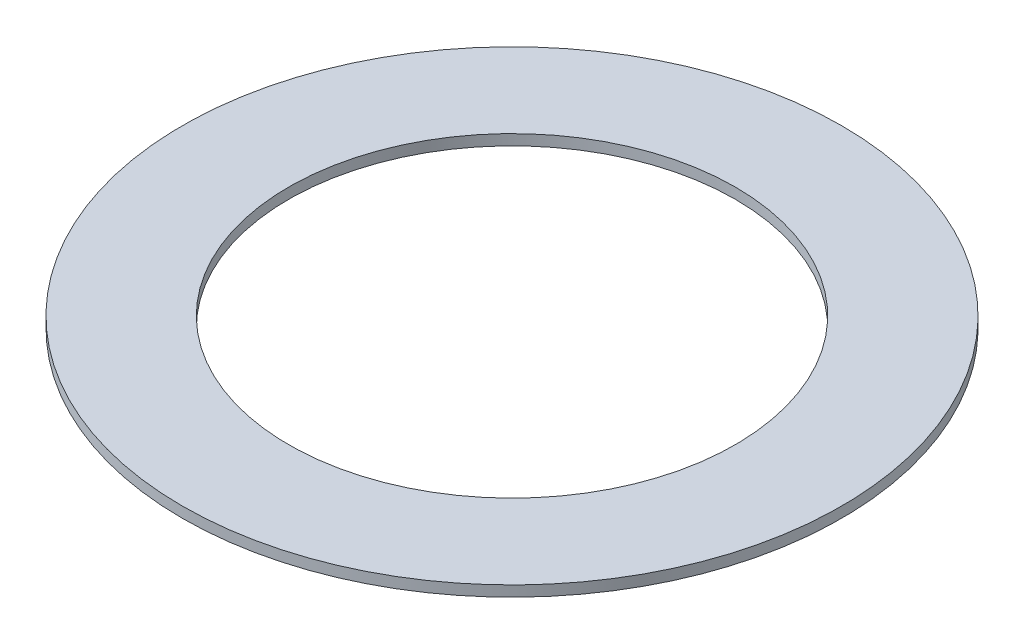
ISO-10303-21;
HEADER;
FILE_DESCRIPTION(('STEP AP214'),'2;1');
FILE_NAME('part.step','',(''),(''),'','','');
FILE_SCHEMA(('AUTOMOTIVE_DESIGN { 1 0 10303 214 1 1 1 1 }'));
ENDSEC;
DATA;
#1=APPLICATION_CONTEXT('core data for automotive mechanical design processes');
#2=APPLICATION_PROTOCOL_DEFINITION('international standard','automotive_design',2000,#1);
#3=PRODUCT_CONTEXT('',#1,'mechanical');
#4=PRODUCT('Part','Part','',(#3));
#5=PRODUCT_RELATED_PRODUCT_CATEGORY('part','',(#4));
#6=PRODUCT_DEFINITION_FORMATION('','',#4);
#7=PRODUCT_DEFINITION_CONTEXT('part definition',#1,'design');
#8=PRODUCT_DEFINITION('design','',#6,#7);
#9=PRODUCT_DEFINITION_SHAPE('','',#8);
#10=(LENGTH_UNIT() NAMED_UNIT(*) SI_UNIT(.MILLI.,.METRE.));
#11=(NAMED_UNIT(*) PLANE_ANGLE_UNIT() SI_UNIT($,.RADIAN.));
#12=(NAMED_UNIT(*) SI_UNIT($,.STERADIAN.) SOLID_ANGLE_UNIT());
#13=UNCERTAINTY_MEASURE_WITH_UNIT(LENGTH_MEASURE(1.E-05),#10,'distance_accuracy_value','');
#14=(GEOMETRIC_REPRESENTATION_CONTEXT(3) GLOBAL_UNCERTAINTY_ASSIGNED_CONTEXT((#13)) GLOBAL_UNIT_ASSIGNED_CONTEXT((#10,
#11,#12)) REPRESENTATION_CONTEXT('',''));
#15=CARTESIAN_POINT('',(0.,0.,0.));
#16=DIRECTION('',(0.,0.,1.));
#17=DIRECTION('',(1.,0.,0.));
#18=AXIS2_PLACEMENT_3D('',#15,#16,#17);
#19=CARTESIAN_POINT('',(0.,0.,0.));
#20=DIRECTION('',(0.,-1.,0.));
#21=DIRECTION('',(0.,0.,-1.));
#22=AXIS2_PLACEMENT_3D('',#19,#20,#21);
#23=CYLINDRICAL_SURFACE('',#22,15.5);
#24=CARTESIAN_POINT('',(0.,0.250000000000001,0.));
#25=DIRECTION('',(0.,-1.,0.));
#26=DIRECTION('',(0.,0.,-1.));
#27=AXIS2_PLACEMENT_3D('',#24,#25,#26);
#28=CIRCLE('',#27,15.5);
#29=CARTESIAN_POINT('',(0.,0.250000000000001,-15.5));
#30=VERTEX_POINT('',#29);
#31=EDGE_CURVE('E69',#30,#30,#28,.T.);
#32=ORIENTED_EDGE('',*,*,#31,.T.);
#33=EDGE_LOOP('',(#32));
#34=FACE_BOUND('',#33,.T.);
#35=CARTESIAN_POINT('',(0.,-0.249999999999999,0.));
#36=DIRECTION('',(0.,-1.,0.));
#37=DIRECTION('',(0.,0.,-1.));
#38=AXIS2_PLACEMENT_3D('',#35,#36,#37);
#39=CIRCLE('',#38,15.5);
#40=CARTESIAN_POINT('',(0.,-0.249999999999999,-15.5));
#41=VERTEX_POINT('',#40);
#42=EDGE_CURVE('E10',#41,#41,#39,.T.);
#43=ORIENTED_EDGE('',*,*,#42,.F.);
#44=EDGE_LOOP('',(#43));
#45=FACE_BOUND('',#44,.T.);
#46=ADVANCED_FACE('F41',(#34,#45),#23,.T.);
#47=CARTESIAN_POINT('',(15.,-0.25,0.));
#48=DIRECTION('',(0.,-1.,0.));
#49=DIRECTION('',(0.,0.,-1.));
#50=AXIS2_PLACEMENT_3D('',#47,#48,#49);
#51=PLANE('',#50);
#52=ORIENTED_EDGE('',*,*,#42,.T.);
#53=EDGE_LOOP('',(#52));
#54=FACE_BOUND('',#53,.T.);
#55=CARTESIAN_POINT('',(0.,-0.250000000000001,0.));
#56=DIRECTION('',(0.,-1.,0.));
#57=DIRECTION('',(0.,0.,-1.));
#58=AXIS2_PLACEMENT_3D('',#55,#56,#57);
#59=CIRCLE('',#58,15.);
#60=CARTESIAN_POINT('',(0.,-0.250000000000001,-15.));
#61=VERTEX_POINT('',#60);
#62=EDGE_CURVE('E47',#61,#61,#59,.T.);
#63=ORIENTED_EDGE('',*,*,#62,.F.);
#64=EDGE_LOOP('',(#63));
#65=FACE_BOUND('',#64,.T.);
#66=ADVANCED_FACE('F87',(#54,#65),#51,.T.);
#67=CARTESIAN_POINT('',(0.,0.,0.));
#68=DIRECTION('',(0.,-1.,0.));
#69=DIRECTION('',(0.,0.,-1.));
#70=AXIS2_PLACEMENT_3D('',#67,#68,#69);
#71=CYLINDRICAL_SURFACE('',#70,15.);
#72=ORIENTED_EDGE('',*,*,#62,.T.);
#73=EDGE_LOOP('',(#72));
#74=FACE_BOUND('',#73,.T.);
#75=CARTESIAN_POINT('',(0.,0.,0.));
#76=DIRECTION('',(0.,-1.,0.));
#77=DIRECTION('',(0.,0.,-1.));
#78=AXIS2_PLACEMENT_3D('',#75,#76,#77);
#79=CIRCLE('',#78,15.);
#80=CARTESIAN_POINT('',(0.,0.,-15.));
#81=VERTEX_POINT('',#80);
#82=EDGE_CURVE('E51',#81,#81,#79,.T.);
#83=ORIENTED_EDGE('',*,*,#82,.F.);
#84=EDGE_LOOP('',(#83));
#85=FACE_BOUND('',#84,.T.);
#86=ADVANCED_FACE('F91',(#74,#85),#71,.F.);
#87=CARTESIAN_POINT('',(11.,0.,0.));
#88=DIRECTION('',(0.,-1.,0.));
#89=DIRECTION('',(0.,0.,-1.));
#90=AXIS2_PLACEMENT_3D('',#87,#88,#89);
#91=PLANE('',#90);
#92=ORIENTED_EDGE('',*,*,#82,.T.);
#93=EDGE_LOOP('',(#92));
#94=FACE_BOUND('',#93,.T.);
#95=CARTESIAN_POINT('',(0.,0.,0.));
#96=DIRECTION('',(0.,-1.,0.));
#97=DIRECTION('',(0.,0.,-1.));
#98=AXIS2_PLACEMENT_3D('',#95,#96,#97);
#99=CIRCLE('',#98,11.);
#100=CARTESIAN_POINT('',(0.,0.,-11.));
#101=VERTEX_POINT('',#100);
#102=EDGE_CURVE('E55',#101,#101,#99,.T.);
#103=ORIENTED_EDGE('',*,*,#102,.F.);
#104=EDGE_LOOP('',(#103));
#105=FACE_BOUND('',#104,.T.);
#106=ADVANCED_FACE('F95',(#94,#105),#91,.T.);
#107=CARTESIAN_POINT('',(0.,0.,0.));
#108=DIRECTION('',(0.,-1.,0.));
#109=DIRECTION('',(0.,0.,-1.));
#110=AXIS2_PLACEMENT_3D('',#107,#108,#109);
#111=CYLINDRICAL_SURFACE('',#110,11.);
#112=ORIENTED_EDGE('',*,*,#102,.T.);
#113=EDGE_LOOP('',(#112));
#114=FACE_BOUND('',#113,.T.);
#115=CARTESIAN_POINT('',(0.,-0.250000000000001,0.));
#116=DIRECTION('',(0.,-1.,0.));
#117=DIRECTION('',(0.,0.,-1.));
#118=AXIS2_PLACEMENT_3D('',#115,#116,#117);
#119=CIRCLE('',#118,11.);
#120=CARTESIAN_POINT('',(0.,-0.250000000000001,-11.));
#121=VERTEX_POINT('',#120);
#122=EDGE_CURVE('E60',#121,#121,#119,.T.);
#123=ORIENTED_EDGE('',*,*,#122,.F.);
#124=EDGE_LOOP('',(#123));
#125=FACE_BOUND('',#124,.T.);
#126=ADVANCED_FACE('F101',(#114,#125),#111,.T.);
#127=CARTESIAN_POINT('',(10.5,-0.25,0.));
#128=DIRECTION('',(0.,-1.,0.));
#129=DIRECTION('',(0.,0.,-1.));
#130=AXIS2_PLACEMENT_3D('',#127,#128,#129);
#131=PLANE('',#130);
#132=ORIENTED_EDGE('',*,*,#122,.T.);
#133=EDGE_LOOP('',(#132));
#134=FACE_BOUND('',#133,.T.);
#135=CARTESIAN_POINT('',(0.,-0.25,0.));
#136=DIRECTION('',(0.,-1.,0.));
#137=DIRECTION('',(0.,0.,-1.));
#138=AXIS2_PLACEMENT_3D('',#135,#136,#137);
#139=CIRCLE('',#138,10.5);
#140=CARTESIAN_POINT('',(0.,-0.25,-10.5));
#141=VERTEX_POINT('',#140);
#142=EDGE_CURVE('E63',#141,#141,#139,.T.);
#143=ORIENTED_EDGE('',*,*,#142,.F.);
#144=EDGE_LOOP('',(#143));
#145=FACE_BOUND('',#144,.T.);
#146=ADVANCED_FACE('F83',(#134,#145),#131,.T.);
#147=CARTESIAN_POINT('',(0.,0.,0.));
#148=DIRECTION('',(0.,-1.,0.));
#149=DIRECTION('',(0.,0.,-1.));
#150=AXIS2_PLACEMENT_3D('',#147,#148,#149);
#151=CYLINDRICAL_SURFACE('',#150,10.5);
#152=ORIENTED_EDGE('',*,*,#142,.T.);
#153=EDGE_LOOP('',(#152));
#154=FACE_BOUND('',#153,.T.);
#155=CARTESIAN_POINT('',(0.,0.25,0.));
#156=DIRECTION('',(0.,-1.,0.));
#157=DIRECTION('',(0.,0.,-1.));
#158=AXIS2_PLACEMENT_3D('',#155,#156,#157);
#159=CIRCLE('',#158,10.5);
#160=CARTESIAN_POINT('',(0.,0.25,-10.5));
#161=VERTEX_POINT('',#160);
#162=EDGE_CURVE('E66',#161,#161,#159,.T.);
#163=ORIENTED_EDGE('',*,*,#162,.F.);
#164=EDGE_LOOP('',(#163));
#165=FACE_BOUND('',#164,.T.);
#166=ADVANCED_FACE('F77',(#154,#165),#151,.F.);
#167=CARTESIAN_POINT('',(10.5,0.250000000000001,0.));
#168=DIRECTION('',(0.,1.,0.));
#169=DIRECTION('',(0.,0.,1.));
#170=AXIS2_PLACEMENT_3D('',#167,#168,#169);
#171=PLANE('',#170);
#172=ORIENTED_EDGE('',*,*,#162,.T.);
#173=EDGE_LOOP('',(#172));
#174=FACE_BOUND('',#173,.T.);
#175=ORIENTED_EDGE('',*,*,#31,.F.);
#176=EDGE_LOOP('',(#175));
#177=FACE_BOUND('',#176,.T.);
#178=ADVANCED_FACE('F75',(#174,#177),#171,.T.);
#179=CLOSED_SHELL('',(#46,#66,#86,#106,#126,#146,#166,#178));
#180=MANIFOLD_SOLID_BREP('B2',#179);
#181=ADVANCED_BREP_SHAPE_REPRESENTATION('',(#18,#180),#14);
#182=SHAPE_DEFINITION_REPRESENTATION(#9,#181);
ENDSEC;
END-ISO-10303-21;
